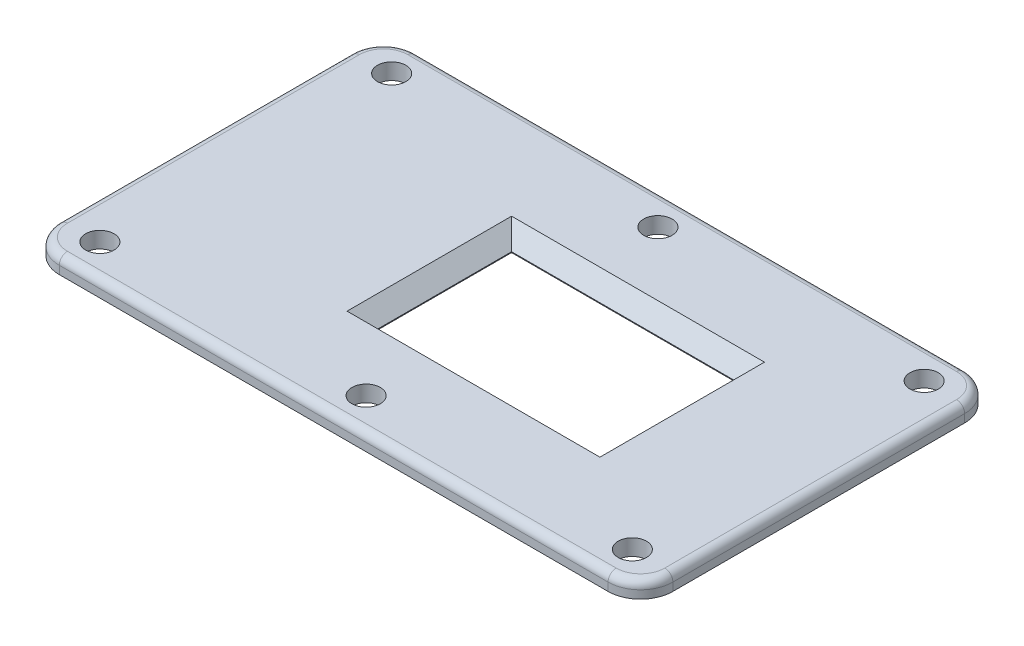
ISO-10303-21;
HEADER;
FILE_DESCRIPTION(('STEP AP214'),'2;1');
FILE_NAME('part.step','',(''),(''),'','','');
FILE_SCHEMA(('AUTOMOTIVE_DESIGN { 1 0 10303 214 1 1 1 1 }'));
ENDSEC;
DATA;
#1=APPLICATION_CONTEXT('core data for automotive mechanical design processes');
#2=APPLICATION_PROTOCOL_DEFINITION('international standard','automotive_design',2000,#1);
#3=PRODUCT_CONTEXT('',#1,'mechanical');
#4=PRODUCT('Part','Part','',(#3));
#5=PRODUCT_RELATED_PRODUCT_CATEGORY('part','',(#4));
#6=PRODUCT_DEFINITION_FORMATION('','',#4);
#7=PRODUCT_DEFINITION_CONTEXT('part definition',#1,'design');
#8=PRODUCT_DEFINITION('design','',#6,#7);
#9=PRODUCT_DEFINITION_SHAPE('','',#8);
#10=(LENGTH_UNIT() NAMED_UNIT(*) SI_UNIT(.MILLI.,.METRE.));
#11=(NAMED_UNIT(*) PLANE_ANGLE_UNIT() SI_UNIT($,.RADIAN.));
#12=(NAMED_UNIT(*) SI_UNIT($,.STERADIAN.) SOLID_ANGLE_UNIT());
#13=UNCERTAINTY_MEASURE_WITH_UNIT(LENGTH_MEASURE(1.E-05),#10,'distance_accuracy_value','');
#14=(GEOMETRIC_REPRESENTATION_CONTEXT(3) GLOBAL_UNCERTAINTY_ASSIGNED_CONTEXT((#13)) GLOBAL_UNIT_ASSIGNED_CONTEXT((#10,
#11,#12)) REPRESENTATION_CONTEXT('',''));
#15=CARTESIAN_POINT('',(0.,0.,0.));
#16=DIRECTION('',(0.,0.,1.));
#17=DIRECTION('',(1.,0.,0.));
#18=AXIS2_PLACEMENT_3D('',#15,#16,#17);
#19=CARTESIAN_POINT('',(13.7,2.,0.));
#20=DIRECTION('',(-1.,0.,0.));
#21=DIRECTION('',(0.,0.,1.));
#22=AXIS2_PLACEMENT_3D('',#19,#20,#21);
#23=PLANE('',#22);
#24=DIRECTION('',(0.,-1.,0.));
#25=VECTOR('',#24,1.);
#26=CARTESIAN_POINT('',(13.7,2.,8.25));
#27=LINE('',#26,#25);
#28=CARTESIAN_POINT('',(13.7,0.0999999999999942,8.25));
#29=VERTEX_POINT('',#28);
#30=CARTESIAN_POINT('',(13.7,0.,8.25));
#31=VERTEX_POINT('',#30);
#32=EDGE_CURVE('E234',#29,#31,#27,.T.);
#33=ORIENTED_EDGE('',*,*,#32,.F.);
#34=DIRECTION('',(0.,0.,-1.));
#35=VECTOR('',#34,1.);
#36=CARTESIAN_POINT('',(13.7,0.0999999999999942,0.));
#37=LINE('',#36,#35);
#38=CARTESIAN_POINT('',(13.7,0.0999999999999942,-8.25));
#39=VERTEX_POINT('',#38);
#40=EDGE_CURVE('E49',#29,#39,#37,.T.);
#41=ORIENTED_EDGE('',*,*,#40,.T.);
#42=DIRECTION('',(0.,-1.,0.));
#43=VECTOR('',#42,1.);
#44=CARTESIAN_POINT('',(13.7,2.,-8.25));
#45=LINE('',#44,#43);
#46=CARTESIAN_POINT('',(13.7,0.,-8.25));
#47=VERTEX_POINT('',#46);
#48=EDGE_CURVE('E176',#39,#47,#45,.T.);
#49=ORIENTED_EDGE('',*,*,#48,.T.);
#50=DIRECTION('',(0.,0.,-1.));
#51=VECTOR('',#50,1.);
#52=CARTESIAN_POINT('',(13.7,0.,0.));
#53=LINE('',#52,#51);
#54=EDGE_CURVE('E216',#31,#47,#53,.T.);
#55=ORIENTED_EDGE('',*,*,#54,.F.);
#56=EDGE_LOOP('',(#33,#41,#49,#55));
#57=FACE_BOUND('',#56,.T.);
#58=ADVANCED_FACE('F39',(#57),#23,.T.);
#59=CARTESIAN_POINT('',(0.,2.,8.25));
#60=DIRECTION('',(0.,0.,-1.));
#61=DIRECTION('',(-1.,0.,0.));
#62=AXIS2_PLACEMENT_3D('',#59,#60,#61);
#63=PLANE('',#62);
#64=DIRECTION('',(0.,-1.,0.));
#65=VECTOR('',#64,1.);
#66=CARTESIAN_POINT('',(-13.7,2.,8.25));
#67=LINE('',#66,#65);
#68=CARTESIAN_POINT('',(-13.7,0.0999999999999942,8.25));
#69=VERTEX_POINT('',#68);
#70=CARTESIAN_POINT('',(-13.7,0.,8.25));
#71=VERTEX_POINT('',#70);
#72=EDGE_CURVE('E232',#69,#71,#67,.T.);
#73=ORIENTED_EDGE('',*,*,#72,.F.);
#74=DIRECTION('',(1.,0.,0.));
#75=VECTOR('',#74,1.);
#76=CARTESIAN_POINT('',(0.,0.0999999999999942,8.25));
#77=LINE('',#76,#75);
#78=EDGE_CURVE('E64',#69,#29,#77,.T.);
#79=ORIENTED_EDGE('',*,*,#78,.T.);
#80=ORIENTED_EDGE('',*,*,#32,.T.);
#81=DIRECTION('',(1.,0.,0.));
#82=VECTOR('',#81,1.);
#83=CARTESIAN_POINT('',(0.,0.,8.25));
#84=LINE('',#83,#82);
#85=EDGE_CURVE('E219',#71,#31,#84,.T.);
#86=ORIENTED_EDGE('',*,*,#85,.F.);
#87=EDGE_LOOP('',(#73,#79,#80,#86));
#88=FACE_BOUND('',#87,.T.);
#89=ADVANCED_FACE('F414',(#88),#63,.T.);
#90=CARTESIAN_POINT('',(-13.7,2.,0.));
#91=DIRECTION('',(-1.,0.,0.));
#92=DIRECTION('',(0.,0.,1.));
#93=AXIS2_PLACEMENT_3D('',#90,#91,#92);
#94=PLANE('',#93);
#95=DIRECTION('',(0.,-1.,0.));
#96=VECTOR('',#95,1.);
#97=CARTESIAN_POINT('',(-13.7,2.,-8.25));
#98=LINE('',#97,#96);
#99=CARTESIAN_POINT('',(-13.7,0.0999999999999942,-8.25));
#100=VERTEX_POINT('',#99);
#101=CARTESIAN_POINT('',(-13.7,0.,-8.25));
#102=VERTEX_POINT('',#101);
#103=EDGE_CURVE('E230',#100,#102,#98,.T.);
#104=ORIENTED_EDGE('',*,*,#103,.F.);
#105=DIRECTION('',(0.,0.,1.));
#106=VECTOR('',#105,1.);
#107=CARTESIAN_POINT('',(-13.7,0.0999999999999942,8.25));
#108=LINE('',#107,#106);
#109=EDGE_CURVE('E314',#100,#69,#108,.T.);
#110=ORIENTED_EDGE('',*,*,#109,.T.);
#111=ORIENTED_EDGE('',*,*,#72,.T.);
#112=DIRECTION('',(0.,0.,-1.));
#113=VECTOR('',#112,1.);
#114=CARTESIAN_POINT('',(-13.7,0.,0.));
#115=LINE('',#114,#113);
#116=EDGE_CURVE('E222',#71,#102,#115,.T.);
#117=ORIENTED_EDGE('',*,*,#116,.T.);
#118=EDGE_LOOP('',(#104,#110,#111,#117));
#119=FACE_BOUND('',#118,.T.);
#120=ADVANCED_FACE('F344',(#119),#94,.F.);
#121=CARTESIAN_POINT('',(0.,2.,-22.));
#122=DIRECTION('',(0.,0.,-1.));
#123=DIRECTION('',(-1.,0.,0.));
#124=AXIS2_PLACEMENT_3D('',#121,#122,#123);
#125=PLANE('',#124);
#126=DIRECTION('',(0.,-1.,0.));
#127=VECTOR('',#126,1.);
#128=CARTESIAN_POINT('',(-39.25,2.,-22.));
#129=LINE('',#128,#127);
#130=CARTESIAN_POINT('',(-39.25,1.,-22.));
#131=VERTEX_POINT('',#130);
#132=CARTESIAN_POINT('',(-39.25,0.,-22.));
#133=VERTEX_POINT('',#132);
#134=EDGE_CURVE('E166',#131,#133,#129,.T.);
#135=ORIENTED_EDGE('',*,*,#134,.F.);
#136=DIRECTION('',(1.,0.,0.));
#137=VECTOR('',#136,1.);
#138=CARTESIAN_POINT('',(0.,1.,-22.));
#139=LINE('',#138,#137);
#140=CARTESIAN_POINT('',(28.45,1.,-22.));
#141=VERTEX_POINT('',#140);
#142=EDGE_CURVE('E272',#131,#141,#139,.T.);
#143=ORIENTED_EDGE('',*,*,#142,.T.);
#144=DIRECTION('',(0.,-1.,0.));
#145=VECTOR('',#144,1.);
#146=CARTESIAN_POINT('',(28.45,2.,-22.));
#147=LINE('',#146,#145);
#148=CARTESIAN_POINT('',(28.45,0.,-22.));
#149=VERTEX_POINT('',#148);
#150=EDGE_CURVE('E193',#141,#149,#147,.T.);
#151=ORIENTED_EDGE('',*,*,#150,.T.);
#152=DIRECTION('',(1.,0.,0.));
#153=VECTOR('',#152,1.);
#154=CARTESIAN_POINT('',(0.,0.,-22.));
#155=LINE('',#154,#153);
#156=EDGE_CURVE('E185',#133,#149,#155,.T.);
#157=ORIENTED_EDGE('',*,*,#156,.F.);
#158=EDGE_LOOP('',(#135,#143,#151,#157));
#159=FACE_BOUND('',#158,.T.);
#160=ADVANCED_FACE('F191',(#159),#125,.T.);
#161=CARTESIAN_POINT('',(-39.25,2.,-18.));
#162=DIRECTION('',(0.,-1.,0.));
#163=DIRECTION('',(0.,0.,-1.));
#164=AXIS2_PLACEMENT_3D('',#161,#162,#163);
#165=CYLINDRICAL_SURFACE('',#164,4.);
#166=DIRECTION('',(0.,-1.,0.));
#167=VECTOR('',#166,1.);
#168=CARTESIAN_POINT('',(-43.25,2.,-18.));
#169=LINE('',#168,#167);
#170=CARTESIAN_POINT('',(-43.25,1.,-18.));
#171=VERTEX_POINT('',#170);
#172=CARTESIAN_POINT('',(-43.25,0.,-18.));
#173=VERTEX_POINT('',#172);
#174=EDGE_CURVE('E177',#171,#173,#169,.T.);
#175=ORIENTED_EDGE('',*,*,#174,.F.);
#176=CARTESIAN_POINT('',(-39.25,1.,-18.));
#177=DIRECTION('',(0.,1.,0.));
#178=DIRECTION('',(0.,0.,1.));
#179=AXIS2_PLACEMENT_3D('',#176,#177,#178);
#180=CIRCLE('',#179,4.);
#181=EDGE_CURVE('E172',#171,#131,#180,.F.);
#182=ORIENTED_EDGE('',*,*,#181,.T.);
#183=ORIENTED_EDGE('',*,*,#134,.T.);
#184=CARTESIAN_POINT('',(-39.25,0.,-18.));
#185=DIRECTION('',(0.,1.,0.));
#186=DIRECTION('',(0.,0.,1.));
#187=AXIS2_PLACEMENT_3D('',#184,#185,#186);
#188=CIRCLE('',#187,4.);
#189=EDGE_CURVE('E170',#133,#173,#188,.T.);
#190=ORIENTED_EDGE('',*,*,#189,.T.);
#191=EDGE_LOOP('',(#175,#182,#183,#190));
#192=FACE_BOUND('',#191,.T.);
#193=ADVANCED_FACE('F169',(#192),#165,.T.);
#194=CARTESIAN_POINT('',(-43.25,2.,0.));
#195=DIRECTION('',(1.,0.,0.));
#196=DIRECTION('',(0.,0.,-1.));
#197=AXIS2_PLACEMENT_3D('',#194,#195,#196);
#198=PLANE('',#197);
#199=DIRECTION('',(0.,-1.,0.));
#200=VECTOR('',#199,1.);
#201=CARTESIAN_POINT('',(-43.25,2.,18.));
#202=LINE('',#201,#200);
#203=CARTESIAN_POINT('',(-43.25,1.,18.));
#204=VERTEX_POINT('',#203);
#205=CARTESIAN_POINT('',(-43.25,0.,18.));
#206=VERTEX_POINT('',#205);
#207=EDGE_CURVE('E247',#204,#206,#202,.T.);
#208=ORIENTED_EDGE('',*,*,#207,.F.);
#209=DIRECTION('',(0.,0.,1.));
#210=VECTOR('',#209,1.);
#211=CARTESIAN_POINT('',(-43.25,1.,-18.));
#212=LINE('',#211,#210);
#213=EDGE_CURVE('E269',#204,#171,#212,.F.);
#214=ORIENTED_EDGE('',*,*,#213,.T.);
#215=ORIENTED_EDGE('',*,*,#174,.T.);
#216=DIRECTION('',(0.,0.,1.));
#217=VECTOR('',#216,1.);
#218=CARTESIAN_POINT('',(-43.25,0.,0.));
#219=LINE('',#218,#217);
#220=EDGE_CURVE('E189',#173,#206,#219,.T.);
#221=ORIENTED_EDGE('',*,*,#220,.T.);
#222=EDGE_LOOP('',(#208,#214,#215,#221));
#223=FACE_BOUND('',#222,.T.);
#224=ADVANCED_FACE('F440',(#223),#198,.F.);
#225=CARTESIAN_POINT('',(-39.25,2.,18.));
#226=DIRECTION('',(0.,-1.,0.));
#227=DIRECTION('',(0.,0.,-1.));
#228=AXIS2_PLACEMENT_3D('',#225,#226,#227);
#229=CYLINDRICAL_SURFACE('',#228,4.);
#230=DIRECTION('',(0.,-1.,0.));
#231=VECTOR('',#230,1.);
#232=CARTESIAN_POINT('',(-39.25,2.,22.));
#233=LINE('',#232,#231);
#234=CARTESIAN_POINT('',(-39.25,1.,22.));
#235=VERTEX_POINT('',#234);
#236=CARTESIAN_POINT('',(-39.25,0.,22.));
#237=VERTEX_POINT('',#236);
#238=EDGE_CURVE('E245',#235,#237,#233,.T.);
#239=ORIENTED_EDGE('',*,*,#238,.F.);
#240=CARTESIAN_POINT('',(-39.25,1.,18.));
#241=DIRECTION('',(0.,1.,0.));
#242=DIRECTION('',(0.,0.,1.));
#243=AXIS2_PLACEMENT_3D('',#240,#241,#242);
#244=CIRCLE('',#243,4.);
#245=EDGE_CURVE('E266',#235,#204,#244,.F.);
#246=ORIENTED_EDGE('',*,*,#245,.T.);
#247=ORIENTED_EDGE('',*,*,#207,.T.);
#248=CARTESIAN_POINT('',(-39.25,0.,18.));
#249=DIRECTION('',(0.,1.,0.));
#250=DIRECTION('',(0.,0.,1.));
#251=AXIS2_PLACEMENT_3D('',#248,#249,#250);
#252=CIRCLE('',#251,4.);
#253=EDGE_CURVE('E202',#206,#237,#252,.T.);
#254=ORIENTED_EDGE('',*,*,#253,.T.);
#255=EDGE_LOOP('',(#239,#246,#247,#254));
#256=FACE_BOUND('',#255,.T.);
#257=ADVANCED_FACE('F436',(#256),#229,.T.);
#258=CARTESIAN_POINT('',(0.,2.,22.));
#259=DIRECTION('',(0.,0.,-1.));
#260=DIRECTION('',(-1.,0.,0.));
#261=AXIS2_PLACEMENT_3D('',#258,#259,#260);
#262=PLANE('',#261);
#263=DIRECTION('',(0.,-1.,0.));
#264=VECTOR('',#263,1.);
#265=CARTESIAN_POINT('',(28.45,2.,22.));
#266=LINE('',#265,#264);
#267=CARTESIAN_POINT('',(28.45,1.,22.));
#268=VERTEX_POINT('',#267);
#269=CARTESIAN_POINT('',(28.45,0.,22.));
#270=VERTEX_POINT('',#269);
#271=EDGE_CURVE('E243',#268,#270,#266,.T.);
#272=ORIENTED_EDGE('',*,*,#271,.F.);
#273=DIRECTION('',(1.,0.,0.));
#274=VECTOR('',#273,1.);
#275=CARTESIAN_POINT('',(-39.25,1.,22.));
#276=LINE('',#275,#274);
#277=EDGE_CURVE('E280',#268,#235,#276,.F.);
#278=ORIENTED_EDGE('',*,*,#277,.T.);
#279=ORIENTED_EDGE('',*,*,#238,.T.);
#280=DIRECTION('',(1.,0.,0.));
#281=VECTOR('',#280,1.);
#282=CARTESIAN_POINT('',(0.,0.,22.));
#283=LINE('',#282,#281);
#284=EDGE_CURVE('E205',#237,#270,#283,.T.);
#285=ORIENTED_EDGE('',*,*,#284,.T.);
#286=EDGE_LOOP('',(#272,#278,#279,#285));
#287=FACE_BOUND('',#286,.T.);
#288=ADVANCED_FACE('F432',(#287),#262,.F.);
#289=CARTESIAN_POINT('',(28.45,2.,18.));
#290=DIRECTION('',(0.,-1.,0.));
#291=DIRECTION('',(0.,0.,-1.));
#292=AXIS2_PLACEMENT_3D('',#289,#290,#291);
#293=CYLINDRICAL_SURFACE('',#292,4.);
#294=DIRECTION('',(0.,-1.,0.));
#295=VECTOR('',#294,1.);
#296=CARTESIAN_POINT('',(32.45,2.,17.9999999999999));
#297=LINE('',#296,#295);
#298=CARTESIAN_POINT('',(32.45,1.,17.9999999999999));
#299=VERTEX_POINT('',#298);
#300=CARTESIAN_POINT('',(32.45,0.,17.9999999999999));
#301=VERTEX_POINT('',#300);
#302=EDGE_CURVE('E241',#299,#301,#297,.T.);
#303=ORIENTED_EDGE('',*,*,#302,.F.);
#304=CARTESIAN_POINT('',(28.45,1.,18.));
#305=DIRECTION('',(0.,1.,0.));
#306=DIRECTION('',(0.,0.,1.));
#307=AXIS2_PLACEMENT_3D('',#304,#305,#306);
#308=CIRCLE('',#307,4.);
#309=EDGE_CURVE('E278',#299,#268,#308,.F.);
#310=ORIENTED_EDGE('',*,*,#309,.T.);
#311=ORIENTED_EDGE('',*,*,#271,.T.);
#312=CARTESIAN_POINT('',(28.45,0.,18.));
#313=DIRECTION('',(0.,1.,0.));
#314=DIRECTION('',(0.,0.,1.));
#315=AXIS2_PLACEMENT_3D('',#312,#313,#314);
#316=CIRCLE('',#315,4.);
#317=EDGE_CURVE('E208',#270,#301,#316,.T.);
#318=ORIENTED_EDGE('',*,*,#317,.T.);
#319=EDGE_LOOP('',(#303,#310,#311,#318));
#320=FACE_BOUND('',#319,.T.);
#321=ADVANCED_FACE('F428',(#320),#293,.T.);
#322=CARTESIAN_POINT('',(32.45,2.,0.));
#323=DIRECTION('',(1.,0.,0.));
#324=DIRECTION('',(0.,0.,-1.));
#325=AXIS2_PLACEMENT_3D('',#322,#323,#324);
#326=PLANE('',#325);
#327=DIRECTION('',(0.,-1.,0.));
#328=VECTOR('',#327,1.);
#329=CARTESIAN_POINT('',(32.45,2.,-18.));
#330=LINE('',#329,#328);
#331=CARTESIAN_POINT('',(32.45,1.,-18.));
#332=VERTEX_POINT('',#331);
#333=CARTESIAN_POINT('',(32.45,0.,-18.));
#334=VERTEX_POINT('',#333);
#335=EDGE_CURVE('E238',#332,#334,#330,.T.);
#336=ORIENTED_EDGE('',*,*,#335,.F.);
#337=DIRECTION('',(0.,0.,1.));
#338=VECTOR('',#337,1.);
#339=CARTESIAN_POINT('',(32.45,1.,0.));
#340=LINE('',#339,#338);
#341=EDGE_CURVE('E276',#332,#299,#340,.T.);
#342=ORIENTED_EDGE('',*,*,#341,.T.);
#343=ORIENTED_EDGE('',*,*,#302,.T.);
#344=DIRECTION('',(0.,0.,1.));
#345=VECTOR('',#344,1.);
#346=CARTESIAN_POINT('',(32.45,0.,0.));
#347=LINE('',#346,#345);
#348=EDGE_CURVE('E211',#334,#301,#347,.T.);
#349=ORIENTED_EDGE('',*,*,#348,.F.);
#350=EDGE_LOOP('',(#336,#342,#343,#349));
#351=FACE_BOUND('',#350,.T.);
#352=ADVANCED_FACE('F424',(#351),#326,.T.);
#353=CARTESIAN_POINT('',(28.45,2.,-18.));
#354=DIRECTION('',(0.,-1.,0.));
#355=DIRECTION('',(0.,0.,-1.));
#356=AXIS2_PLACEMENT_3D('',#353,#354,#355);
#357=CYLINDRICAL_SURFACE('',#356,4.);
#358=ORIENTED_EDGE('',*,*,#150,.F.);
#359=CARTESIAN_POINT('',(28.45,1.,-18.));
#360=DIRECTION('',(0.,1.,0.));
#361=DIRECTION('',(0.,0.,1.));
#362=AXIS2_PLACEMENT_3D('',#359,#360,#361);
#363=CIRCLE('',#362,4.);
#364=EDGE_CURVE('E274',#141,#332,#363,.F.);
#365=ORIENTED_EDGE('',*,*,#364,.T.);
#366=ORIENTED_EDGE('',*,*,#335,.T.);
#367=CARTESIAN_POINT('',(28.45,0.,-18.));
#368=DIRECTION('',(0.,1.,0.));
#369=DIRECTION('',(0.,0.,1.));
#370=AXIS2_PLACEMENT_3D('',#367,#368,#369);
#371=CIRCLE('',#370,4.);
#372=EDGE_CURVE('E214',#149,#334,#371,.F.);
#373=ORIENTED_EDGE('',*,*,#372,.F.);
#374=EDGE_LOOP('',(#358,#365,#366,#373));
#375=FACE_BOUND('',#374,.T.);
#376=ADVANCED_FACE('F411',(#375),#357,.T.);
#377=CARTESIAN_POINT('',(-5.4,2.,18.));
#378=DIRECTION('',(0.,-1.,0.));
#379=DIRECTION('',(0.,0.,-1.));
#380=AXIS2_PLACEMENT_3D('',#377,#378,#379);
#381=CYLINDRICAL_SURFACE('',#380,1.75000000000001);
#382=CARTESIAN_POINT('',(-5.4,2.,18.));
#383=DIRECTION('',(0.,1.,0.));
#384=DIRECTION('',(0.,0.,1.));
#385=AXIS2_PLACEMENT_3D('',#382,#383,#384);
#386=CIRCLE('',#385,1.75000000000001);
#387=CARTESIAN_POINT('',(-5.4,2.,19.75));
#388=VERTEX_POINT('',#387);
#389=EDGE_CURVE('E239',#388,#388,#386,.F.);
#390=ORIENTED_EDGE('',*,*,#389,.F.);
#391=EDGE_LOOP('',(#390));
#392=FACE_BOUND('',#391,.T.);
#393=CARTESIAN_POINT('',(-5.4,0.,18.));
#394=DIRECTION('',(0.,1.,0.));
#395=DIRECTION('',(0.,0.,1.));
#396=AXIS2_PLACEMENT_3D('',#393,#394,#395);
#397=CIRCLE('',#396,1.75000000000001);
#398=CARTESIAN_POINT('',(-5.4,0.,19.75));
#399=VERTEX_POINT('',#398);
#400=EDGE_CURVE('E194',#399,#399,#397,.F.);
#401=ORIENTED_EDGE('',*,*,#400,.T.);
#402=EDGE_LOOP('',(#401));
#403=FACE_BOUND('',#402,.T.);
#404=ADVANCED_FACE('F401',(#392,#403),#381,.F.);
#405=CARTESIAN_POINT('',(27.45,2.,18.));
#406=DIRECTION('',(0.,-1.,0.));
#407=DIRECTION('',(0.,0.,-1.));
#408=AXIS2_PLACEMENT_3D('',#405,#406,#407);
#409=CYLINDRICAL_SURFACE('',#408,1.75);
#410=CARTESIAN_POINT('',(27.45,2.,18.));
#411=DIRECTION('',(0.,1.,0.));
#412=DIRECTION('',(0.,0.,1.));
#413=AXIS2_PLACEMENT_3D('',#410,#411,#412);
#414=CIRCLE('',#413,1.75);
#415=CARTESIAN_POINT('',(27.45,2.,19.75));
#416=VERTEX_POINT('',#415);
#417=EDGE_CURVE('E375',#416,#416,#414,.T.);
#418=ORIENTED_EDGE('',*,*,#417,.T.);
#419=EDGE_LOOP('',(#418));
#420=FACE_BOUND('',#419,.T.);
#421=CARTESIAN_POINT('',(27.45,0.,18.));
#422=DIRECTION('',(0.,1.,0.));
#423=DIRECTION('',(0.,0.,1.));
#424=AXIS2_PLACEMENT_3D('',#421,#422,#423);
#425=CIRCLE('',#424,1.75);
#426=CARTESIAN_POINT('',(27.45,0.,19.75));
#427=VERTEX_POINT('',#426);
#428=EDGE_CURVE('E197',#427,#427,#425,.T.);
#429=ORIENTED_EDGE('',*,*,#428,.F.);
#430=EDGE_LOOP('',(#429));
#431=FACE_BOUND('',#430,.T.);
#432=ADVANCED_FACE('F398',(#420,#431),#409,.F.);
#433=CARTESIAN_POINT('',(-5.4,2.,-18.));
#434=DIRECTION('',(0.,-1.,0.));
#435=DIRECTION('',(0.,0.,-1.));
#436=AXIS2_PLACEMENT_3D('',#433,#434,#435);
#437=CYLINDRICAL_SURFACE('',#436,1.75);
#438=CARTESIAN_POINT('',(-5.4,2.,-18.));
#439=DIRECTION('',(0.,1.,0.));
#440=DIRECTION('',(0.,0.,1.));
#441=AXIS2_PLACEMENT_3D('',#438,#439,#440);
#442=CIRCLE('',#441,1.75);
#443=CARTESIAN_POINT('',(-5.4,2.,-16.25));
#444=VERTEX_POINT('',#443);
#445=EDGE_CURVE('E371',#444,#444,#442,.T.);
#446=ORIENTED_EDGE('',*,*,#445,.T.);
#447=EDGE_LOOP('',(#446));
#448=FACE_BOUND('',#447,.T.);
#449=CARTESIAN_POINT('',(-5.4,0.,-18.));
#450=DIRECTION('',(0.,1.,0.));
#451=DIRECTION('',(0.,0.,1.));
#452=AXIS2_PLACEMENT_3D('',#449,#450,#451);
#453=CIRCLE('',#452,1.75);
#454=CARTESIAN_POINT('',(-5.4,0.,-16.25));
#455=VERTEX_POINT('',#454);
#456=EDGE_CURVE('E391',#455,#455,#453,.T.);
#457=ORIENTED_EDGE('',*,*,#456,.F.);
#458=EDGE_LOOP('',(#457));
#459=FACE_BOUND('',#458,.T.);
#460=ADVANCED_FACE('F400',(#448,#459),#437,.F.);
#461=CARTESIAN_POINT('',(-38.25,2.,-18.));
#462=DIRECTION('',(0.,-1.,0.));
#463=DIRECTION('',(0.,0.,-1.));
#464=AXIS2_PLACEMENT_3D('',#461,#462,#463);
#465=CYLINDRICAL_SURFACE('',#464,1.75);
#466=CARTESIAN_POINT('',(-38.25,2.,-18.));
#467=DIRECTION('',(0.,1.,0.));
#468=DIRECTION('',(0.,0.,1.));
#469=AXIS2_PLACEMENT_3D('',#466,#467,#468);
#470=CIRCLE('',#469,1.75);
#471=CARTESIAN_POINT('',(-38.25,2.,-16.25));
#472=VERTEX_POINT('',#471);
#473=EDGE_CURVE('E367',#472,#472,#470,.T.);
#474=ORIENTED_EDGE('',*,*,#473,.T.);
#475=EDGE_LOOP('',(#474));
#476=FACE_BOUND('',#475,.T.);
#477=CARTESIAN_POINT('',(-38.25,0.,-18.));
#478=DIRECTION('',(0.,1.,0.));
#479=DIRECTION('',(0.,0.,1.));
#480=AXIS2_PLACEMENT_3D('',#477,#478,#479);
#481=CIRCLE('',#480,1.75);
#482=CARTESIAN_POINT('',(-38.25,0.,-16.25));
#483=VERTEX_POINT('',#482);
#484=EDGE_CURVE('E388',#483,#483,#481,.T.);
#485=ORIENTED_EDGE('',*,*,#484,.F.);
#486=EDGE_LOOP('',(#485));
#487=FACE_BOUND('',#486,.T.);
#488=ADVANCED_FACE('F408',(#476,#487),#465,.F.);
#489=CARTESIAN_POINT('',(27.45,2.,-18.));
#490=DIRECTION('',(0.,-1.,0.));
#491=DIRECTION('',(0.,0.,-1.));
#492=AXIS2_PLACEMENT_3D('',#489,#490,#491);
#493=CYLINDRICAL_SURFACE('',#492,1.75);
#494=CARTESIAN_POINT('',(27.45,2.,-18.));
#495=DIRECTION('',(0.,1.,0.));
#496=DIRECTION('',(0.,0.,1.));
#497=AXIS2_PLACEMENT_3D('',#494,#495,#496);
#498=CIRCLE('',#497,1.75);
#499=CARTESIAN_POINT('',(27.45,2.,-16.25));
#500=VERTEX_POINT('',#499);
#501=EDGE_CURVE('E363',#500,#500,#498,.F.);
#502=ORIENTED_EDGE('',*,*,#501,.F.);
#503=EDGE_LOOP('',(#502));
#504=FACE_BOUND('',#503,.T.);
#505=CARTESIAN_POINT('',(27.45,0.,-18.));
#506=DIRECTION('',(0.,1.,0.));
#507=DIRECTION('',(0.,0.,1.));
#508=AXIS2_PLACEMENT_3D('',#505,#506,#507);
#509=CIRCLE('',#508,1.75);
#510=CARTESIAN_POINT('',(27.45,0.,-16.25));
#511=VERTEX_POINT('',#510);
#512=EDGE_CURVE('E385',#511,#511,#509,.F.);
#513=ORIENTED_EDGE('',*,*,#512,.T.);
#514=EDGE_LOOP('',(#513));
#515=FACE_BOUND('',#514,.T.);
#516=ADVANCED_FACE('F476',(#504,#515),#493,.F.);
#517=CARTESIAN_POINT('',(-38.25,2.,18.));
#518=DIRECTION('',(0.,-1.,0.));
#519=DIRECTION('',(0.,0.,-1.));
#520=AXIS2_PLACEMENT_3D('',#517,#518,#519);
#521=CYLINDRICAL_SURFACE('',#520,1.75);
#522=CARTESIAN_POINT('',(-38.25,2.,18.));
#523=DIRECTION('',(0.,1.,0.));
#524=DIRECTION('',(0.,0.,1.));
#525=AXIS2_PLACEMENT_3D('',#522,#523,#524);
#526=CIRCLE('',#525,1.75);
#527=CARTESIAN_POINT('',(-38.25,2.,19.75));
#528=VERTEX_POINT('',#527);
#529=EDGE_CURVE('E228',#528,#528,#526,.F.);
#530=ORIENTED_EDGE('',*,*,#529,.F.);
#531=EDGE_LOOP('',(#530));
#532=FACE_BOUND('',#531,.T.);
#533=CARTESIAN_POINT('',(-38.25,0.,18.));
#534=DIRECTION('',(0.,1.,0.));
#535=DIRECTION('',(0.,0.,1.));
#536=AXIS2_PLACEMENT_3D('',#533,#534,#535);
#537=CIRCLE('',#536,1.75);
#538=CARTESIAN_POINT('',(-38.25,0.,19.75));
#539=VERTEX_POINT('',#538);
#540=EDGE_CURVE('E305',#539,#539,#537,.F.);
#541=ORIENTED_EDGE('',*,*,#540,.T.);
#542=EDGE_LOOP('',(#541));
#543=FACE_BOUND('',#542,.T.);
#544=ADVANCED_FACE('F456',(#532,#543),#521,.F.);
#545=CARTESIAN_POINT('',(0.,2.,-8.25));
#546=DIRECTION('',(0.,0.,-1.));
#547=DIRECTION('',(-1.,0.,0.));
#548=AXIS2_PLACEMENT_3D('',#545,#546,#547);
#549=PLANE('',#548);
#550=ORIENTED_EDGE('',*,*,#48,.F.);
#551=DIRECTION('',(-1.,0.,0.));
#552=VECTOR('',#551,1.);
#553=CARTESIAN_POINT('',(-13.7,0.0999999999999942,-8.25));
#554=LINE('',#553,#552);
#555=EDGE_CURVE('E11',#39,#100,#554,.T.);
#556=ORIENTED_EDGE('',*,*,#555,.T.);
#557=ORIENTED_EDGE('',*,*,#103,.T.);
#558=DIRECTION('',(1.,0.,0.));
#559=VECTOR('',#558,1.);
#560=CARTESIAN_POINT('',(0.,0.,-8.25));
#561=LINE('',#560,#559);
#562=EDGE_CURVE('E225',#102,#47,#561,.T.);
#563=ORIENTED_EDGE('',*,*,#562,.T.);
#564=EDGE_LOOP('',(#550,#556,#557,#563));
#565=FACE_BOUND('',#564,.T.);
#566=ADVANCED_FACE('F340',(#565),#549,.F.);
#567=CARTESIAN_POINT('',(0.,2.,0.));
#568=DIRECTION('',(0.,1.,0.));
#569=DIRECTION('',(0.,0.,1.));
#570=AXIS2_PLACEMENT_3D('',#567,#568,#569);
#571=PLANE('',#570);
#572=DIRECTION('',(-1.,0.,0.));
#573=VECTOR('',#572,1.);
#574=CARTESIAN_POINT('',(0.,2.,10.15));
#575=LINE('',#574,#573);
#576=CARTESIAN_POINT('',(15.6,2.,10.15));
#577=VERTEX_POINT('',#576);
#578=CARTESIAN_POINT('',(-15.6,2.,10.15));
#579=VERTEX_POINT('',#578);
#580=EDGE_CURVE('E309',#577,#579,#575,.T.);
#581=ORIENTED_EDGE('',*,*,#580,.T.);
#582=DIRECTION('',(0.,0.,-1.));
#583=VECTOR('',#582,1.);
#584=CARTESIAN_POINT('',(-15.6,2.,-8.25));
#585=LINE('',#584,#583);
#586=CARTESIAN_POINT('',(-15.6,2.,-10.15));
#587=VERTEX_POINT('',#586);
#588=EDGE_CURVE('E311',#579,#587,#585,.T.);
#589=ORIENTED_EDGE('',*,*,#588,.T.);
#590=DIRECTION('',(1.,0.,0.));
#591=VECTOR('',#590,1.);
#592=CARTESIAN_POINT('',(13.7,2.,-10.15));
#593=LINE('',#592,#591);
#594=CARTESIAN_POINT('',(15.6,2.,-10.15));
#595=VERTEX_POINT('',#594);
#596=EDGE_CURVE('E282',#587,#595,#593,.T.);
#597=ORIENTED_EDGE('',*,*,#596,.T.);
#598=DIRECTION('',(0.,0.,1.));
#599=VECTOR('',#598,1.);
#600=CARTESIAN_POINT('',(15.6,2.,0.));
#601=LINE('',#600,#599);
#602=EDGE_CURVE('E307',#595,#577,#601,.T.);
#603=ORIENTED_EDGE('',*,*,#602,.T.);
#604=EDGE_LOOP('',(#581,#589,#597,#603));
#605=FACE_BOUND('',#604,.T.);
#606=DIRECTION('',(0.,0.,1.));
#607=VECTOR('',#606,1.);
#608=CARTESIAN_POINT('',(-42.25,2.,18.));
#609=LINE('',#608,#607);
#610=CARTESIAN_POINT('',(-42.25,2.,-18.));
#611=VERTEX_POINT('',#610);
#612=CARTESIAN_POINT('',(-42.25,2.,18.));
#613=VERTEX_POINT('',#612);
#614=EDGE_CURVE('E261',#611,#613,#609,.T.);
#615=ORIENTED_EDGE('',*,*,#614,.T.);
#616=CARTESIAN_POINT('',(-39.25,2.,18.));
#617=DIRECTION('',(0.,1.,0.));
#618=DIRECTION('',(0.,0.,1.));
#619=AXIS2_PLACEMENT_3D('',#616,#617,#618);
#620=CIRCLE('',#619,3.);
#621=CARTESIAN_POINT('',(-39.25,2.,21.));
#622=VERTEX_POINT('',#621);
#623=EDGE_CURVE('E263',#613,#622,#620,.T.);
#624=ORIENTED_EDGE('',*,*,#623,.T.);
#625=DIRECTION('',(1.,0.,0.));
#626=VECTOR('',#625,1.);
#627=CARTESIAN_POINT('',(28.45,2.,21.));
#628=LINE('',#627,#626);
#629=CARTESIAN_POINT('',(28.45,2.,21.));
#630=VERTEX_POINT('',#629);
#631=EDGE_CURVE('E236',#622,#630,#628,.T.);
#632=ORIENTED_EDGE('',*,*,#631,.T.);
#633=CARTESIAN_POINT('',(28.45,2.,18.));
#634=DIRECTION('',(0.,1.,0.));
#635=DIRECTION('',(0.,0.,1.));
#636=AXIS2_PLACEMENT_3D('',#633,#634,#635);
#637=CIRCLE('',#636,3.);
#638=CARTESIAN_POINT('',(31.45,2.,17.9999999999999));
#639=VERTEX_POINT('',#638);
#640=EDGE_CURVE('E251',#630,#639,#637,.T.);
#641=ORIENTED_EDGE('',*,*,#640,.T.);
#642=DIRECTION('',(0.,0.,1.));
#643=VECTOR('',#642,1.);
#644=CARTESIAN_POINT('',(31.45,2.,0.));
#645=LINE('',#644,#643);
#646=CARTESIAN_POINT('',(31.45,2.,-18.));
#647=VERTEX_POINT('',#646);
#648=EDGE_CURVE('E253',#639,#647,#645,.F.);
#649=ORIENTED_EDGE('',*,*,#648,.T.);
#650=CARTESIAN_POINT('',(28.45,2.,-18.));
#651=DIRECTION('',(0.,1.,0.));
#652=DIRECTION('',(0.,0.,1.));
#653=AXIS2_PLACEMENT_3D('',#650,#651,#652);
#654=CIRCLE('',#653,3.);
#655=CARTESIAN_POINT('',(28.45,2.,-21.));
#656=VERTEX_POINT('',#655);
#657=EDGE_CURVE('E255',#647,#656,#654,.T.);
#658=ORIENTED_EDGE('',*,*,#657,.T.);
#659=DIRECTION('',(1.,0.,0.));
#660=VECTOR('',#659,1.);
#661=CARTESIAN_POINT('',(0.,2.,-21.));
#662=LINE('',#661,#660);
#663=CARTESIAN_POINT('',(-39.25,2.,-21.));
#664=VERTEX_POINT('',#663);
#665=EDGE_CURVE('E257',#656,#664,#662,.F.);
#666=ORIENTED_EDGE('',*,*,#665,.T.);
#667=CARTESIAN_POINT('',(-39.25,2.,-18.));
#668=DIRECTION('',(0.,1.,0.));
#669=DIRECTION('',(0.,0.,1.));
#670=AXIS2_PLACEMENT_3D('',#667,#668,#669);
#671=CIRCLE('',#670,3.);
#672=EDGE_CURVE('E259',#664,#611,#671,.T.);
#673=ORIENTED_EDGE('',*,*,#672,.T.);
#674=EDGE_LOOP('',(#615,#624,#632,#641,#649,#658,#666,#673));
#675=FACE_BOUND('',#674,.T.);
#676=ORIENTED_EDGE('',*,*,#529,.T.);
#677=EDGE_LOOP('',(#676));
#678=FACE_BOUND('',#677,.T.);
#679=ORIENTED_EDGE('',*,*,#501,.T.);
#680=EDGE_LOOP('',(#679));
#681=FACE_BOUND('',#680,.T.);
#682=ORIENTED_EDGE('',*,*,#473,.F.);
#683=EDGE_LOOP('',(#682));
#684=FACE_BOUND('',#683,.T.);
#685=ORIENTED_EDGE('',*,*,#445,.F.);
#686=EDGE_LOOP('',(#685));
#687=FACE_BOUND('',#686,.T.);
#688=ORIENTED_EDGE('',*,*,#417,.F.);
#689=EDGE_LOOP('',(#688));
#690=FACE_BOUND('',#689,.T.);
#691=ORIENTED_EDGE('',*,*,#389,.T.);
#692=EDGE_LOOP('',(#691));
#693=FACE_BOUND('',#692,.T.);
#694=ADVANCED_FACE('F350',(#605,#675,#678,#681,#684,#687,#690,#693),#571,.T.);
#695=CARTESIAN_POINT('',(0.,0.,0.));
#696=DIRECTION('',(0.,1.,0.));
#697=DIRECTION('',(0.,0.,1.));
#698=AXIS2_PLACEMENT_3D('',#695,#696,#697);
#699=PLANE('',#698);
#700=ORIENTED_EDGE('',*,*,#540,.F.);
#701=EDGE_LOOP('',(#700));
#702=FACE_BOUND('',#701,.T.);
#703=ORIENTED_EDGE('',*,*,#512,.F.);
#704=EDGE_LOOP('',(#703));
#705=FACE_BOUND('',#704,.T.);
#706=ORIENTED_EDGE('',*,*,#484,.T.);
#707=EDGE_LOOP('',(#706));
#708=FACE_BOUND('',#707,.T.);
#709=ORIENTED_EDGE('',*,*,#456,.T.);
#710=EDGE_LOOP('',(#709));
#711=FACE_BOUND('',#710,.T.);
#712=ORIENTED_EDGE('',*,*,#428,.T.);
#713=EDGE_LOOP('',(#712));
#714=FACE_BOUND('',#713,.T.);
#715=ORIENTED_EDGE('',*,*,#400,.F.);
#716=EDGE_LOOP('',(#715));
#717=FACE_BOUND('',#716,.T.);
#718=ORIENTED_EDGE('',*,*,#156,.T.);
#719=ORIENTED_EDGE('',*,*,#372,.T.);
#720=ORIENTED_EDGE('',*,*,#348,.T.);
#721=ORIENTED_EDGE('',*,*,#317,.F.);
#722=ORIENTED_EDGE('',*,*,#284,.F.);
#723=ORIENTED_EDGE('',*,*,#253,.F.);
#724=ORIENTED_EDGE('',*,*,#220,.F.);
#725=ORIENTED_EDGE('',*,*,#189,.F.);
#726=EDGE_LOOP('',(#718,#719,#720,#721,#722,#723,#724,#725));
#727=FACE_BOUND('',#726,.T.);
#728=ORIENTED_EDGE('',*,*,#54,.T.);
#729=ORIENTED_EDGE('',*,*,#562,.F.);
#730=ORIENTED_EDGE('',*,*,#116,.F.);
#731=ORIENTED_EDGE('',*,*,#85,.T.);
#732=EDGE_LOOP('',(#728,#729,#730,#731));
#733=FACE_BOUND('',#732,.T.);
#734=ADVANCED_FACE('F182',(#702,#705,#708,#711,#714,#717,#727,#733),#699,.F.);
#735=CARTESIAN_POINT('',(28.45,1.,-18.));
#736=DIRECTION('',(0.,1.,0.));
#737=DIRECTION('',(0.,0.,1.));
#738=AXIS2_PLACEMENT_3D('',#735,#736,#737);
#739=TOROIDAL_SURFACE('',#738,3.,1.);
#740=CARTESIAN_POINT('',(31.45,1.,-18.));
#741=DIRECTION('',(0.,0.,1.));
#742=DIRECTION('',(1.,0.,0.));
#743=AXIS2_PLACEMENT_3D('',#740,#741,#742);
#744=CIRCLE('',#743,1.);
#745=EDGE_CURVE('E299',#332,#647,#744,.T.);
#746=ORIENTED_EDGE('',*,*,#745,.F.);
#747=ORIENTED_EDGE('',*,*,#364,.F.);
#748=CARTESIAN_POINT('',(28.45,1.,-21.));
#749=DIRECTION('',(-1.,0.,0.));
#750=DIRECTION('',(0.,0.,1.));
#751=AXIS2_PLACEMENT_3D('',#748,#749,#750);
#752=CIRCLE('',#751,1.);
#753=EDGE_CURVE('E302',#656,#141,#752,.T.);
#754=ORIENTED_EDGE('',*,*,#753,.F.);
#755=ORIENTED_EDGE('',*,*,#657,.F.);
#756=EDGE_LOOP('',(#746,#747,#754,#755));
#757=FACE_BOUND('',#756,.T.);
#758=ADVANCED_FACE('F458',(#757),#739,.T.);
#759=CARTESIAN_POINT('',(0.,1.,-21.));
#760=DIRECTION('',(1.,0.,0.));
#761=DIRECTION('',(0.,0.,-1.));
#762=AXIS2_PLACEMENT_3D('',#759,#760,#761);
#763=CYLINDRICAL_SURFACE('',#762,1.);
#764=ORIENTED_EDGE('',*,*,#753,.T.);
#765=ORIENTED_EDGE('',*,*,#142,.F.);
#766=CARTESIAN_POINT('',(-39.25,1.,-21.));
#767=DIRECTION('',(-1.,0.,0.));
#768=DIRECTION('',(0.,0.,1.));
#769=AXIS2_PLACEMENT_3D('',#766,#767,#768);
#770=CIRCLE('',#769,1.);
#771=EDGE_CURVE('E296',#664,#131,#770,.T.);
#772=ORIENTED_EDGE('',*,*,#771,.F.);
#773=ORIENTED_EDGE('',*,*,#665,.F.);
#774=EDGE_LOOP('',(#764,#765,#772,#773));
#775=FACE_BOUND('',#774,.T.);
#776=ADVANCED_FACE('F463',(#775),#763,.T.);
#777=CARTESIAN_POINT('',(31.45,1.,0.));
#778=DIRECTION('',(0.,0.,1.));
#779=DIRECTION('',(1.,0.,0.));
#780=AXIS2_PLACEMENT_3D('',#777,#778,#779);
#781=CYLINDRICAL_SURFACE('',#780,1.);
#782=ORIENTED_EDGE('',*,*,#745,.T.);
#783=ORIENTED_EDGE('',*,*,#648,.F.);
#784=CARTESIAN_POINT('',(31.45,1.,17.9999999999999));
#785=DIRECTION('',(0.,0.,1.));
#786=DIRECTION('',(1.,0.,0.));
#787=AXIS2_PLACEMENT_3D('',#784,#785,#786);
#788=CIRCLE('',#787,1.);
#789=EDGE_CURVE('E293',#299,#639,#788,.T.);
#790=ORIENTED_EDGE('',*,*,#789,.F.);
#791=ORIENTED_EDGE('',*,*,#341,.F.);
#792=EDGE_LOOP('',(#782,#783,#790,#791));
#793=FACE_BOUND('',#792,.T.);
#794=ADVANCED_FACE('F507',(#793),#781,.T.);
#795=CARTESIAN_POINT('',(-39.25,1.,-18.));
#796=DIRECTION('',(0.,1.,0.));
#797=DIRECTION('',(0.,0.,1.));
#798=AXIS2_PLACEMENT_3D('',#795,#796,#797);
#799=TOROIDAL_SURFACE('',#798,3.,1.);
#800=ORIENTED_EDGE('',*,*,#771,.T.);
#801=ORIENTED_EDGE('',*,*,#181,.F.);
#802=CARTESIAN_POINT('',(-42.25,1.,-18.));
#803=DIRECTION('',(0.,0.,1.));
#804=DIRECTION('',(1.,0.,0.));
#805=AXIS2_PLACEMENT_3D('',#802,#803,#804);
#806=CIRCLE('',#805,1.);
#807=EDGE_CURVE('E290',#611,#171,#806,.T.);
#808=ORIENTED_EDGE('',*,*,#807,.F.);
#809=ORIENTED_EDGE('',*,*,#672,.F.);
#810=EDGE_LOOP('',(#800,#801,#808,#809));
#811=FACE_BOUND('',#810,.T.);
#812=ADVANCED_FACE('F503',(#811),#799,.T.);
#813=CARTESIAN_POINT('',(28.45,1.,18.));
#814=DIRECTION('',(0.,1.,0.));
#815=DIRECTION('',(0.,0.,1.));
#816=AXIS2_PLACEMENT_3D('',#813,#814,#815);
#817=TOROIDAL_SURFACE('',#816,3.,1.);
#818=ORIENTED_EDGE('',*,*,#789,.T.);
#819=ORIENTED_EDGE('',*,*,#640,.F.);
#820=CARTESIAN_POINT('',(28.45,1.,21.));
#821=DIRECTION('',(-1.,0.,0.));
#822=DIRECTION('',(0.,0.,1.));
#823=AXIS2_PLACEMENT_3D('',#820,#821,#822);
#824=CIRCLE('',#823,1.);
#825=EDGE_CURVE('E287',#268,#630,#824,.T.);
#826=ORIENTED_EDGE('',*,*,#825,.F.);
#827=ORIENTED_EDGE('',*,*,#309,.F.);
#828=EDGE_LOOP('',(#818,#819,#826,#827));
#829=FACE_BOUND('',#828,.T.);
#830=ADVANCED_FACE('F499',(#829),#817,.T.);
#831=CARTESIAN_POINT('',(-42.25,1.,0.));
#832=DIRECTION('',(0.,0.,-1.));
#833=DIRECTION('',(-1.,0.,0.));
#834=AXIS2_PLACEMENT_3D('',#831,#832,#833);
#835=CYLINDRICAL_SURFACE('',#834,1.);
#836=ORIENTED_EDGE('',*,*,#807,.T.);
#837=ORIENTED_EDGE('',*,*,#213,.F.);
#838=CARTESIAN_POINT('',(-42.25,1.,18.));
#839=DIRECTION('',(0.,0.,1.));
#840=DIRECTION('',(1.,0.,0.));
#841=AXIS2_PLACEMENT_3D('',#838,#839,#840);
#842=CIRCLE('',#841,1.);
#843=EDGE_CURVE('E285',#613,#204,#842,.T.);
#844=ORIENTED_EDGE('',*,*,#843,.F.);
#845=ORIENTED_EDGE('',*,*,#614,.F.);
#846=EDGE_LOOP('',(#836,#837,#844,#845));
#847=FACE_BOUND('',#846,.T.);
#848=ADVANCED_FACE('F495',(#847),#835,.T.);
#849=CARTESIAN_POINT('',(0.,1.,21.));
#850=DIRECTION('',(-1.,0.,0.));
#851=DIRECTION('',(0.,0.,1.));
#852=AXIS2_PLACEMENT_3D('',#849,#850,#851);
#853=CYLINDRICAL_SURFACE('',#852,1.);
#854=ORIENTED_EDGE('',*,*,#825,.T.);
#855=ORIENTED_EDGE('',*,*,#631,.F.);
#856=CARTESIAN_POINT('',(-39.25,1.,21.));
#857=DIRECTION('',(-1.,0.,0.));
#858=DIRECTION('',(0.,-1.,0.));
#859=AXIS2_PLACEMENT_3D('',#856,#857,#858);
#860=CIRCLE('',#859,1.);
#861=EDGE_CURVE('E283',#235,#622,#860,.T.);
#862=ORIENTED_EDGE('',*,*,#861,.F.);
#863=ORIENTED_EDGE('',*,*,#277,.F.);
#864=EDGE_LOOP('',(#854,#855,#862,#863));
#865=FACE_BOUND('',#864,.T.);
#866=ADVANCED_FACE('F491',(#865),#853,.T.);
#867=CARTESIAN_POINT('',(-39.25,1.,18.));
#868=DIRECTION('',(0.,1.,0.));
#869=DIRECTION('',(0.,0.,1.));
#870=AXIS2_PLACEMENT_3D('',#867,#868,#869);
#871=TOROIDAL_SURFACE('',#870,3.,1.);
#872=ORIENTED_EDGE('',*,*,#843,.T.);
#873=ORIENTED_EDGE('',*,*,#245,.F.);
#874=ORIENTED_EDGE('',*,*,#861,.T.);
#875=ORIENTED_EDGE('',*,*,#623,.F.);
#876=EDGE_LOOP('',(#872,#873,#874,#875));
#877=FACE_BOUND('',#876,.T.);
#878=ADVANCED_FACE('F488',(#877),#871,.T.);
#879=CARTESIAN_POINT('',(13.7,0.0999999999999942,0.));
#880=DIRECTION('',(0.707106781186547,-0.707106781186547,0.));
#881=DIRECTION('',(0.,0.,-1.));
#882=AXIS2_PLACEMENT_3D('',#879,#880,#881);
#883=PLANE('',#882);
#884=DIRECTION('',(-0.577350269189626,-0.577350269189626,0.577350269189626));
#885=VECTOR('',#884,1.);
#886=CARTESIAN_POINT('',(10.95,-2.65000000000001,-5.5));
#887=LINE('',#886,#885);
#888=EDGE_CURVE('E322',#39,#595,#887,.F.);
#889=ORIENTED_EDGE('',*,*,#888,.F.);
#890=ORIENTED_EDGE('',*,*,#40,.F.);
#891=DIRECTION('',(0.577350269189626,0.577350269189626,0.577350269189626));
#892=VECTOR('',#891,1.);
#893=CARTESIAN_POINT('',(9.13333333333333,-4.46666666666667,3.68333333333333));
#894=LINE('',#893,#892);
#895=EDGE_CURVE('E44',#577,#29,#894,.F.);
#896=ORIENTED_EDGE('',*,*,#895,.F.);
#897=ORIENTED_EDGE('',*,*,#602,.F.);
#898=EDGE_LOOP('',(#889,#890,#896,#897));
#899=FACE_BOUND('',#898,.T.);
#900=ADVANCED_FACE('F42',(#899),#883,.F.);
#901=CARTESIAN_POINT('',(0.,0.0999999999999942,8.25));
#902=DIRECTION('',(0.,-0.707106781186547,0.707106781186547));
#903=DIRECTION('',(1.,0.,0.));
#904=AXIS2_PLACEMENT_3D('',#901,#902,#903);
#905=PLANE('',#904);
#906=ORIENTED_EDGE('',*,*,#895,.T.);
#907=ORIENTED_EDGE('',*,*,#78,.F.);
#908=DIRECTION('',(0.577350269189626,-0.577350269189626,-0.577350269189626));
#909=VECTOR('',#908,1.);
#910=CARTESIAN_POINT('',(-12.2166666666667,-1.38333333333334,6.76666666666667));
#911=LINE('',#910,#909);
#912=EDGE_CURVE('E321',#579,#69,#911,.T.);
#913=ORIENTED_EDGE('',*,*,#912,.F.);
#914=ORIENTED_EDGE('',*,*,#580,.F.);
#915=EDGE_LOOP('',(#906,#907,#913,#914));
#916=FACE_BOUND('',#915,.T.);
#917=ADVANCED_FACE('F332',(#916),#905,.F.);
#918=CARTESIAN_POINT('',(0.,2.,-10.15));
#919=DIRECTION('',(0.,0.707106781186547,0.707106781186547));
#920=DIRECTION('',(-1.,0.,0.));
#921=AXIS2_PLACEMENT_3D('',#918,#919,#920);
#922=PLANE('',#921);
#923=ORIENTED_EDGE('',*,*,#888,.T.);
#924=ORIENTED_EDGE('',*,*,#596,.F.);
#925=DIRECTION('',(0.577350269189626,-0.577350269189626,0.577350269189626));
#926=VECTOR('',#925,1.);
#927=CARTESIAN_POINT('',(-12.2166666666667,-1.38333333333334,-6.76666666666667));
#928=LINE('',#927,#926);
#929=EDGE_CURVE('E319',#100,#587,#928,.F.);
#930=ORIENTED_EDGE('',*,*,#929,.F.);
#931=ORIENTED_EDGE('',*,*,#555,.F.);
#932=EDGE_LOOP('',(#923,#924,#930,#931));
#933=FACE_BOUND('',#932,.T.);
#934=ADVANCED_FACE('F337',(#933),#922,.T.);
#935=CARTESIAN_POINT('',(-15.6,2.,0.));
#936=DIRECTION('',(0.707106781186547,0.707106781186547,0.));
#937=DIRECTION('',(0.,0.,1.));
#938=AXIS2_PLACEMENT_3D('',#935,#936,#937);
#939=PLANE('',#938);
#940=ORIENTED_EDGE('',*,*,#912,.T.);
#941=ORIENTED_EDGE('',*,*,#109,.F.);
#942=ORIENTED_EDGE('',*,*,#929,.T.);
#943=ORIENTED_EDGE('',*,*,#588,.F.);
#944=EDGE_LOOP('',(#940,#941,#942,#943));
#945=FACE_BOUND('',#944,.T.);
#946=ADVANCED_FACE('F347',(#945),#939,.T.);
#947=CLOSED_SHELL('',(#58,#89,#120,#160,#193,#224,#257,#288,#321,#352,#376,#404,#432,#460,#488,
#516,#544,#566,#694,#734,#758,#776,#794,#812,#830,#848,#866,#878,#900,#917,#934,#946));
#948=MANIFOLD_SOLID_BREP('B2',#947);
#949=ADVANCED_BREP_SHAPE_REPRESENTATION('',(#18,#948),#14);
#950=SHAPE_DEFINITION_REPRESENTATION(#9,#949);
ENDSEC;
END-ISO-10303-21;
